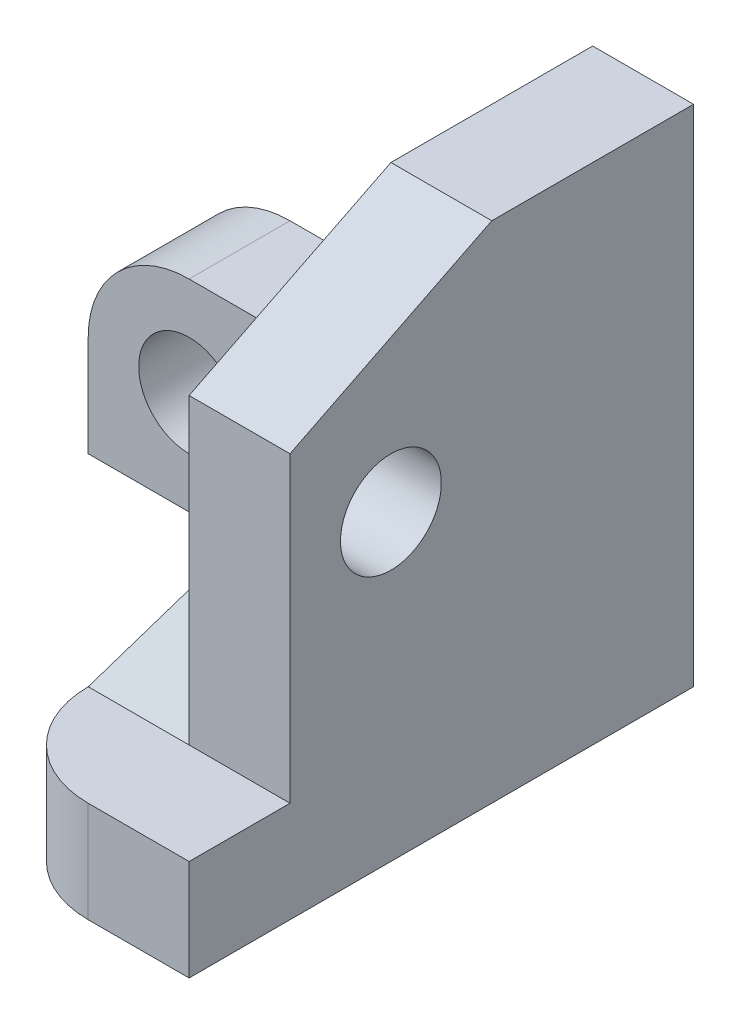
ISO-10303-21;
HEADER;
FILE_DESCRIPTION(('STEP AP214'),'2;1');
FILE_NAME('part.step','',(''),(''),'','','');
FILE_SCHEMA(('AUTOMOTIVE_DESIGN { 1 0 10303 214 1 1 1 1 }'));
ENDSEC;
DATA;
#1=APPLICATION_CONTEXT('core data for automotive mechanical design processes');
#2=APPLICATION_PROTOCOL_DEFINITION('international standard','automotive_design',2000,#1);
#3=PRODUCT_CONTEXT('',#1,'mechanical');
#4=PRODUCT('Part','Part','',(#3));
#5=PRODUCT_RELATED_PRODUCT_CATEGORY('part','',(#4));
#6=PRODUCT_DEFINITION_FORMATION('','',#4);
#7=PRODUCT_DEFINITION_CONTEXT('part definition',#1,'design');
#8=PRODUCT_DEFINITION('design','',#6,#7);
#9=PRODUCT_DEFINITION_SHAPE('','',#8);
#10=(LENGTH_UNIT() NAMED_UNIT(*) SI_UNIT(.MILLI.,.METRE.));
#11=(NAMED_UNIT(*) PLANE_ANGLE_UNIT() SI_UNIT($,.RADIAN.));
#12=(NAMED_UNIT(*) SI_UNIT($,.STERADIAN.) SOLID_ANGLE_UNIT());
#13=UNCERTAINTY_MEASURE_WITH_UNIT(LENGTH_MEASURE(1.E-05),#10,'distance_accuracy_value','');
#14=(GEOMETRIC_REPRESENTATION_CONTEXT(3) GLOBAL_UNCERTAINTY_ASSIGNED_CONTEXT((#13)) GLOBAL_UNIT_ASSIGNED_CONTEXT((#10,
#11,#12)) REPRESENTATION_CONTEXT('',''));
#15=CARTESIAN_POINT('',(0.,0.,0.));
#16=DIRECTION('',(0.,0.,1.));
#17=DIRECTION('',(1.,0.,0.));
#18=AXIS2_PLACEMENT_3D('',#15,#16,#17);
#19=CARTESIAN_POINT('',(50.,50.,40.));
#20=DIRECTION('',(0.,0.,-1.));
#21=DIRECTION('',(-1.,0.,0.));
#22=AXIS2_PLACEMENT_3D('',#19,#20,#21);
#23=PLANE('',#22);
#24=DIRECTION('',(-1.,0.,0.));
#25=VECTOR('',#24,1.);
#26=CARTESIAN_POINT('',(50.,10.,40.));
#27=LINE('',#26,#25);
#28=CARTESIAN_POINT('',(50.,10.,40.));
#29=VERTEX_POINT('',#28);
#30=CARTESIAN_POINT('',(40.,10.,40.));
#31=VERTEX_POINT('',#30);
#32=EDGE_CURVE('E149',#29,#31,#27,.T.);
#33=ORIENTED_EDGE('',*,*,#32,.F.);
#34=DIRECTION('',(0.,-1.,0.));
#35=VECTOR('',#34,1.);
#36=CARTESIAN_POINT('',(50.,50.,40.));
#37=LINE('',#36,#35);
#38=CARTESIAN_POINT('',(50.,40.,40.));
#39=VERTEX_POINT('',#38);
#40=EDGE_CURVE('E164',#39,#29,#37,.T.);
#41=ORIENTED_EDGE('',*,*,#40,.F.);
#42=DIRECTION('',(-1.,0.,0.));
#43=VECTOR('',#42,1.);
#44=CARTESIAN_POINT('',(80.,40.,40.));
#45=LINE('',#44,#43);
#46=CARTESIAN_POINT('',(40.,40.,40.));
#47=VERTEX_POINT('',#46);
#48=EDGE_CURVE('E253',#39,#47,#45,.T.);
#49=ORIENTED_EDGE('',*,*,#48,.T.);
#50=DIRECTION('',(0.,-1.,0.));
#51=VECTOR('',#50,1.);
#52=CARTESIAN_POINT('',(40.,50.,40.));
#53=LINE('',#52,#51);
#54=EDGE_CURVE('E166',#47,#31,#53,.T.);
#55=ORIENTED_EDGE('',*,*,#54,.T.);
#56=EDGE_LOOP('',(#33,#41,#49,#55));
#57=FACE_BOUND('',#56,.T.);
#58=ADVANCED_FACE('F43',(#57),#23,.F.);
#59=CARTESIAN_POINT('',(10.,10.,10.));
#60=DIRECTION('',(0.,0.,1.));
#61=DIRECTION('',(1.,0.,0.));
#62=AXIS2_PLACEMENT_3D('',#59,#60,#61);
#63=PLANE('',#62);
#64=CARTESIAN_POINT('',(10.,10.,10.));
#65=DIRECTION('',(0.,0.,1.));
#66=DIRECTION('',(1.,0.,0.));
#67=AXIS2_PLACEMENT_3D('',#64,#65,#66);
#68=CIRCLE('',#67,5.);
#69=CARTESIAN_POINT('',(15.,10.,10.));
#70=VERTEX_POINT('',#69);
#71=EDGE_CURVE('E187',#70,#70,#68,.T.);
#72=ORIENTED_EDGE('',*,*,#71,.F.);
#73=EDGE_LOOP('',(#72));
#74=FACE_BOUND('',#73,.T.);
#75=DIRECTION('',(1.,0.,0.));
#76=VECTOR('',#75,1.);
#77=CARTESIAN_POINT('',(0.,0.,10.));
#78=LINE('',#77,#76);
#79=CARTESIAN_POINT('',(0.,0.,10.));
#80=VERTEX_POINT('',#79);
#81=CARTESIAN_POINT('',(30.,0.,10.));
#82=VERTEX_POINT('',#81);
#83=EDGE_CURVE('E92',#80,#82,#78,.T.);
#84=ORIENTED_EDGE('',*,*,#83,.T.);
#85=DIRECTION('',(0.,-1.,0.));
#86=VECTOR('',#85,1.);
#87=CARTESIAN_POINT('',(30.,0.,10.));
#88=LINE('',#87,#86);
#89=CARTESIAN_POINT('',(30.,20.,10.));
#90=VERTEX_POINT('',#89);
#91=EDGE_CURVE('E273',#90,#82,#88,.T.);
#92=ORIENTED_EDGE('',*,*,#91,.F.);
#93=DIRECTION('',(-1.,0.,0.));
#94=VECTOR('',#93,1.);
#95=CARTESIAN_POINT('',(40.,20.,10.));
#96=LINE('',#95,#94);
#97=CARTESIAN_POINT('',(10.,20.,10.));
#98=VERTEX_POINT('',#97);
#99=EDGE_CURVE('E200',#90,#98,#96,.T.);
#100=ORIENTED_EDGE('',*,*,#99,.T.);
#101=CARTESIAN_POINT('',(10.,10.,10.));
#102=DIRECTION('',(0.,0.,1.));
#103=DIRECTION('',(1.,0.,0.));
#104=AXIS2_PLACEMENT_3D('',#101,#102,#103);
#105=CIRCLE('',#104,10.);
#106=CARTESIAN_POINT('',(0.,10.,10.));
#107=VERTEX_POINT('',#106);
#108=EDGE_CURVE('E68',#98,#107,#105,.T.);
#109=ORIENTED_EDGE('',*,*,#108,.T.);
#110=DIRECTION('',(0.,-1.,0.));
#111=VECTOR('',#110,1.);
#112=CARTESIAN_POINT('',(0.,10.,10.));
#113=LINE('',#112,#111);
#114=EDGE_CURVE('E195',#107,#80,#113,.T.);
#115=ORIENTED_EDGE('',*,*,#114,.T.);
#116=EDGE_LOOP('',(#84,#92,#100,#109,#115));
#117=FACE_BOUND('',#116,.T.);
#118=ADVANCED_FACE('F316',(#74,#117),#63,.T.);
#119=CARTESIAN_POINT('',(40.,50.,40.));
#120=DIRECTION('',(1.,0.,0.));
#121=DIRECTION('',(0.,0.,-1.));
#122=AXIS2_PLACEMENT_3D('',#119,#120,#121);
#123=PLANE('',#122);
#124=CARTESIAN_POINT('',(40.,30.,30.));
#125=DIRECTION('',(-1.,0.,0.));
#126=DIRECTION('',(0.,0.,1.));
#127=AXIS2_PLACEMENT_3D('',#124,#125,#126);
#128=CIRCLE('',#127,5.);
#129=CARTESIAN_POINT('',(40.,30.,35.));
#130=VERTEX_POINT('',#129);
#131=EDGE_CURVE('E266',#130,#130,#128,.T.);
#132=ORIENTED_EDGE('',*,*,#131,.F.);
#133=EDGE_LOOP('',(#132));
#134=FACE_BOUND('',#133,.T.);
#135=DIRECTION('',(0.,0.316227766016838,-0.948683298050514));
#136=VECTOR('',#135,1.);
#137=CARTESIAN_POINT('',(40.,20.,10.));
#138=LINE('',#137,#136);
#139=CARTESIAN_POINT('',(40.,20.,10.));
#140=VERTEX_POINT('',#139);
#141=EDGE_CURVE('E274',#31,#140,#138,.T.);
#142=ORIENTED_EDGE('',*,*,#141,.F.);
#143=ORIENTED_EDGE('',*,*,#54,.F.);
#144=DIRECTION('',(0.,-0.447213595499958,0.894427190999916));
#145=VECTOR('',#144,1.);
#146=CARTESIAN_POINT('',(40.,40.,40.));
#147=LINE('',#146,#145);
#148=CARTESIAN_POINT('',(40.,50.,20.));
#149=VERTEX_POINT('',#148);
#150=EDGE_CURVE('E263',#149,#47,#147,.T.);
#151=ORIENTED_EDGE('',*,*,#150,.F.);
#152=DIRECTION('',(0.,0.,1.));
#153=VECTOR('',#152,1.);
#154=CARTESIAN_POINT('',(40.,50.,0.));
#155=LINE('',#154,#153);
#156=CARTESIAN_POINT('',(40.,50.,0.));
#157=VERTEX_POINT('',#156);
#158=EDGE_CURVE('E251',#157,#149,#155,.T.);
#159=ORIENTED_EDGE('',*,*,#158,.F.);
#160=DIRECTION('',(0.,-1.,0.));
#161=VECTOR('',#160,1.);
#162=CARTESIAN_POINT('',(40.,50.,0.));
#163=LINE('',#162,#161);
#164=CARTESIAN_POINT('',(40.,20.,0.));
#165=VERTEX_POINT('',#164);
#166=EDGE_CURVE('E177',#157,#165,#163,.T.);
#167=ORIENTED_EDGE('',*,*,#166,.T.);
#168=DIRECTION('',(0.,0.,-1.));
#169=VECTOR('',#168,1.);
#170=CARTESIAN_POINT('',(40.,20.,10.));
#171=LINE('',#170,#169);
#172=EDGE_CURVE('E224',#140,#165,#171,.T.);
#173=ORIENTED_EDGE('',*,*,#172,.F.);
#174=EDGE_LOOP('',(#142,#143,#151,#159,#167,#173));
#175=FACE_BOUND('',#174,.T.);
#176=ADVANCED_FACE('F339',(#134,#175),#123,.F.);
#177=CARTESIAN_POINT('',(10.,10.,0.));
#178=DIRECTION('',(0.,0.,1.));
#179=DIRECTION('',(1.,0.,0.));
#180=AXIS2_PLACEMENT_3D('',#177,#178,#179);
#181=PLANE('',#180);
#182=DIRECTION('',(0.,-1.,0.));
#183=VECTOR('',#182,1.);
#184=CARTESIAN_POINT('',(0.,10.,0.));
#185=LINE('',#184,#183);
#186=CARTESIAN_POINT('',(0.,10.,0.));
#187=VERTEX_POINT('',#186);
#188=CARTESIAN_POINT('',(0.,0.,0.));
#189=VERTEX_POINT('',#188);
#190=EDGE_CURVE('E191',#187,#189,#185,.T.);
#191=ORIENTED_EDGE('',*,*,#190,.F.);
#192=CARTESIAN_POINT('',(10.,10.,0.));
#193=DIRECTION('',(0.,0.,1.));
#194=DIRECTION('',(1.,0.,0.));
#195=AXIS2_PLACEMENT_3D('',#192,#193,#194);
#196=CIRCLE('',#195,10.);
#197=CARTESIAN_POINT('',(10.,20.,0.));
#198=VERTEX_POINT('',#197);
#199=EDGE_CURVE('E85',#198,#187,#196,.T.);
#200=ORIENTED_EDGE('',*,*,#199,.F.);
#201=DIRECTION('',(-1.,0.,0.));
#202=VECTOR('',#201,1.);
#203=CARTESIAN_POINT('',(40.,20.,0.));
#204=LINE('',#203,#202);
#205=EDGE_CURVE('E214',#165,#198,#204,.T.);
#206=ORIENTED_EDGE('',*,*,#205,.F.);
#207=ORIENTED_EDGE('',*,*,#166,.F.);
#208=DIRECTION('',(-1.,0.,0.));
#209=VECTOR('',#208,1.);
#210=CARTESIAN_POINT('',(40.,50.,0.));
#211=LINE('',#210,#209);
#212=CARTESIAN_POINT('',(50.,50.,0.));
#213=VERTEX_POINT('',#212);
#214=EDGE_CURVE('E243',#213,#157,#211,.T.);
#215=ORIENTED_EDGE('',*,*,#214,.F.);
#216=DIRECTION('',(0.,-1.,0.));
#217=VECTOR('',#216,1.);
#218=CARTESIAN_POINT('',(50.,50.,0.));
#219=LINE('',#218,#217);
#220=CARTESIAN_POINT('',(50.,0.,0.));
#221=VERTEX_POINT('',#220);
#222=EDGE_CURVE('E173',#213,#221,#219,.T.);
#223=ORIENTED_EDGE('',*,*,#222,.T.);
#224=DIRECTION('',(1.,0.,0.));
#225=VECTOR('',#224,1.);
#226=CARTESIAN_POINT('',(0.,0.,0.));
#227=LINE('',#226,#225);
#228=EDGE_CURVE('E211',#189,#221,#227,.T.);
#229=ORIENTED_EDGE('',*,*,#228,.F.);
#230=EDGE_LOOP('',(#191,#200,#206,#207,#215,#223,#229));
#231=FACE_BOUND('',#230,.T.);
#232=CARTESIAN_POINT('',(10.,10.,0.));
#233=DIRECTION('',(0.,0.,1.));
#234=DIRECTION('',(1.,0.,0.));
#235=AXIS2_PLACEMENT_3D('',#232,#233,#234);
#236=CIRCLE('',#235,5.);
#237=CARTESIAN_POINT('',(15.,10.,0.));
#238=VERTEX_POINT('',#237);
#239=EDGE_CURVE('E186',#238,#238,#236,.T.);
#240=ORIENTED_EDGE('',*,*,#239,.T.);
#241=EDGE_LOOP('',(#240));
#242=FACE_BOUND('',#241,.T.);
#243=ADVANCED_FACE('F236',(#231,#242),#181,.F.);
#244=CARTESIAN_POINT('',(0.,10.,10.));
#245=DIRECTION('',(1.,0.,0.));
#246=DIRECTION('',(0.,1.,0.));
#247=AXIS2_PLACEMENT_3D('',#244,#245,#246);
#248=PLANE('',#247);
#249=ORIENTED_EDGE('',*,*,#190,.T.);
#250=DIRECTION('',(0.,0.,-1.));
#251=VECTOR('',#250,1.);
#252=CARTESIAN_POINT('',(0.,0.,10.));
#253=LINE('',#252,#251);
#254=EDGE_CURVE('E53',#80,#189,#253,.T.);
#255=ORIENTED_EDGE('',*,*,#254,.F.);
#256=ORIENTED_EDGE('',*,*,#114,.F.);
#257=DIRECTION('',(0.,0.,-1.));
#258=VECTOR('',#257,1.);
#259=CARTESIAN_POINT('',(0.,10.,10.));
#260=LINE('',#259,#258);
#261=EDGE_CURVE('E207',#107,#187,#260,.T.);
#262=ORIENTED_EDGE('',*,*,#261,.T.);
#263=EDGE_LOOP('',(#249,#255,#256,#262));
#264=FACE_BOUND('',#263,.T.);
#265=ADVANCED_FACE('F45',(#264),#248,.F.);
#266=CARTESIAN_POINT('',(0.,0.,10.));
#267=DIRECTION('',(0.,1.,0.));
#268=DIRECTION('',(0.,0.,1.));
#269=AXIS2_PLACEMENT_3D('',#266,#267,#268);
#270=PLANE('',#269);
#271=ORIENTED_EDGE('',*,*,#228,.T.);
#272=DIRECTION('',(0.,0.,-1.));
#273=VECTOR('',#272,1.);
#274=CARTESIAN_POINT('',(50.,0.,0.));
#275=LINE('',#274,#273);
#276=CARTESIAN_POINT('',(50.,0.,50.));
#277=VERTEX_POINT('',#276);
#278=EDGE_CURVE('E244',#277,#221,#275,.T.);
#279=ORIENTED_EDGE('',*,*,#278,.F.);
#280=DIRECTION('',(1.,0.,0.));
#281=VECTOR('',#280,1.);
#282=CARTESIAN_POINT('',(40.,0.,50.));
#283=LINE('',#282,#281);
#284=CARTESIAN_POINT('',(40.,0.,50.));
#285=VERTEX_POINT('',#284);
#286=EDGE_CURVE('E158',#285,#277,#283,.T.);
#287=ORIENTED_EDGE('',*,*,#286,.F.);
#288=CARTESIAN_POINT('',(40.,0.,40.));
#289=DIRECTION('',(0.,1.,0.));
#290=DIRECTION('',(0.,0.,1.));
#291=AXIS2_PLACEMENT_3D('',#288,#289,#290);
#292=CIRCLE('',#291,10.);
#293=CARTESIAN_POINT('',(30.,0.,40.));
#294=VERTEX_POINT('',#293);
#295=EDGE_CURVE('E298',#294,#285,#292,.T.);
#296=ORIENTED_EDGE('',*,*,#295,.F.);
#297=DIRECTION('',(0.,0.,1.));
#298=VECTOR('',#297,1.);
#299=CARTESIAN_POINT('',(30.,0.,40.));
#300=LINE('',#299,#298);
#301=EDGE_CURVE('E277',#82,#294,#300,.T.);
#302=ORIENTED_EDGE('',*,*,#301,.F.);
#303=ORIENTED_EDGE('',*,*,#83,.F.);
#304=ORIENTED_EDGE('',*,*,#254,.T.);
#305=EDGE_LOOP('',(#271,#279,#287,#296,#302,#303,#304));
#306=FACE_BOUND('',#305,.T.);
#307=ADVANCED_FACE('F230',(#306),#270,.F.);
#308=CARTESIAN_POINT('',(40.,20.,10.));
#309=DIRECTION('',(0.,-1.,0.));
#310=DIRECTION('',(1.,0.,0.));
#311=AXIS2_PLACEMENT_3D('',#308,#309,#310);
#312=PLANE('',#311);
#313=ORIENTED_EDGE('',*,*,#205,.T.);
#314=DIRECTION('',(0.,0.,-1.));
#315=VECTOR('',#314,1.);
#316=CARTESIAN_POINT('',(10.,20.,10.));
#317=LINE('',#316,#315);
#318=EDGE_CURVE('E221',#98,#198,#317,.T.);
#319=ORIENTED_EDGE('',*,*,#318,.F.);
#320=ORIENTED_EDGE('',*,*,#99,.F.);
#321=EDGE_CURVE('E201',#140,#90,#96,.T.);
#322=ORIENTED_EDGE('',*,*,#321,.F.);
#323=ORIENTED_EDGE('',*,*,#172,.T.);
#324=EDGE_LOOP('',(#313,#319,#320,#322,#323));
#325=FACE_BOUND('',#324,.T.);
#326=ADVANCED_FACE('F320',(#325),#312,.F.);
#327=CARTESIAN_POINT('',(10.,10.,10.));
#328=DIRECTION('',(0.,0.,-1.));
#329=DIRECTION('',(-1.,0.,0.));
#330=AXIS2_PLACEMENT_3D('',#327,#328,#329);
#331=CYLINDRICAL_SURFACE('',#330,10.);
#332=ORIENTED_EDGE('',*,*,#199,.T.);
#333=ORIENTED_EDGE('',*,*,#261,.F.);
#334=ORIENTED_EDGE('',*,*,#108,.F.);
#335=ORIENTED_EDGE('',*,*,#318,.T.);
#336=EDGE_LOOP('',(#332,#333,#334,#335));
#337=FACE_BOUND('',#336,.T.);
#338=ADVANCED_FACE('F322',(#337),#331,.T.);
#339=CARTESIAN_POINT('',(10.,10.,10.));
#340=DIRECTION('',(0.,0.,-1.));
#341=DIRECTION('',(-1.,0.,0.));
#342=AXIS2_PLACEMENT_3D('',#339,#340,#341);
#343=CYLINDRICAL_SURFACE('',#342,5.);
#344=ORIENTED_EDGE('',*,*,#71,.T.);
#345=EDGE_LOOP('',(#344));
#346=FACE_BOUND('',#345,.T.);
#347=ORIENTED_EDGE('',*,*,#239,.F.);
#348=EDGE_LOOP('',(#347));
#349=FACE_BOUND('',#348,.T.);
#350=ADVANCED_FACE('F324',(#346,#349),#343,.F.);
#351=CARTESIAN_POINT('',(50.,50.,0.));
#352=DIRECTION('',(-1.,0.,0.));
#353=DIRECTION('',(0.,0.,1.));
#354=AXIS2_PLACEMENT_3D('',#351,#352,#353);
#355=PLANE('',#354);
#356=CARTESIAN_POINT('',(50.,30.,30.));
#357=DIRECTION('',(-1.,0.,0.));
#358=DIRECTION('',(0.,0.,1.));
#359=AXIS2_PLACEMENT_3D('',#356,#357,#358);
#360=CIRCLE('',#359,5.);
#361=CARTESIAN_POINT('',(50.,30.,35.));
#362=VERTEX_POINT('',#361);
#363=EDGE_CURVE('E47',#362,#362,#360,.T.);
#364=ORIENTED_EDGE('',*,*,#363,.T.);
#365=EDGE_LOOP('',(#364));
#366=FACE_BOUND('',#365,.T.);
#367=DIRECTION('',(0.,0.,-1.));
#368=VECTOR('',#367,1.);
#369=CARTESIAN_POINT('',(50.,50.,0.));
#370=LINE('',#369,#368);
#371=CARTESIAN_POINT('',(50.,50.,20.));
#372=VERTEX_POINT('',#371);
#373=EDGE_CURVE('E180',#372,#213,#370,.T.);
#374=ORIENTED_EDGE('',*,*,#373,.F.);
#375=DIRECTION('',(0.,-0.447213595499958,0.894427190999916));
#376=VECTOR('',#375,1.);
#377=CARTESIAN_POINT('',(50.,58.,4.));
#378=LINE('',#377,#376);
#379=EDGE_CURVE('E60',#372,#39,#378,.T.);
#380=ORIENTED_EDGE('',*,*,#379,.T.);
#381=ORIENTED_EDGE('',*,*,#40,.T.);
#382=DIRECTION('',(0.,0.,-1.));
#383=VECTOR('',#382,1.);
#384=CARTESIAN_POINT('',(50.,10.,50.));
#385=LINE('',#384,#383);
#386=CARTESIAN_POINT('',(50.,10.,50.));
#387=VERTEX_POINT('',#386);
#388=EDGE_CURVE('E146',#387,#29,#385,.T.);
#389=ORIENTED_EDGE('',*,*,#388,.F.);
#390=DIRECTION('',(0.,-1.,0.));
#391=VECTOR('',#390,1.);
#392=CARTESIAN_POINT('',(50.,10.,50.));
#393=LINE('',#392,#391);
#394=EDGE_CURVE('E245',#387,#277,#393,.T.);
#395=ORIENTED_EDGE('',*,*,#394,.T.);
#396=ORIENTED_EDGE('',*,*,#278,.T.);
#397=ORIENTED_EDGE('',*,*,#222,.F.);
#398=EDGE_LOOP('',(#374,#380,#381,#389,#395,#396,#397));
#399=FACE_BOUND('',#398,.T.);
#400=ADVANCED_FACE('F171',(#366,#399),#355,.F.);
#401=CARTESIAN_POINT('',(0.,50.,0.));
#402=DIRECTION('',(0.,-1.,0.));
#403=DIRECTION('',(0.,0.,-1.));
#404=AXIS2_PLACEMENT_3D('',#401,#402,#403);
#405=PLANE('',#404);
#406=ORIENTED_EDGE('',*,*,#158,.T.);
#407=DIRECTION('',(1.,0.,0.));
#408=VECTOR('',#407,1.);
#409=CARTESIAN_POINT('',(0.,50.,20.));
#410=LINE('',#409,#408);
#411=EDGE_CURVE('E11',#149,#372,#410,.T.);
#412=ORIENTED_EDGE('',*,*,#411,.T.);
#413=ORIENTED_EDGE('',*,*,#373,.T.);
#414=ORIENTED_EDGE('',*,*,#214,.T.);
#415=EDGE_LOOP('',(#406,#412,#413,#414));
#416=FACE_BOUND('',#415,.T.);
#417=ADVANCED_FACE('F433',(#416),#405,.F.);
#418=CARTESIAN_POINT('',(80.,40.,40.));
#419=DIRECTION('',(0.,-0.894427190999916,-0.447213595499958));
#420=DIRECTION('',(0.,0.447213595499958,-0.894427190999916));
#421=AXIS2_PLACEMENT_3D('',#418,#419,#420);
#422=PLANE('',#421);
#423=ORIENTED_EDGE('',*,*,#411,.F.);
#424=ORIENTED_EDGE('',*,*,#150,.T.);
#425=ORIENTED_EDGE('',*,*,#48,.F.);
#426=ORIENTED_EDGE('',*,*,#379,.F.);
#427=EDGE_LOOP('',(#423,#424,#425,#426));
#428=FACE_BOUND('',#427,.T.);
#429=ADVANCED_FACE('F473',(#428),#422,.F.);
#430=CARTESIAN_POINT('',(80.,30.,30.));
#431=DIRECTION('',(-1.,0.,0.));
#432=DIRECTION('',(0.,0.,1.));
#433=AXIS2_PLACEMENT_3D('',#430,#431,#432);
#434=CYLINDRICAL_SURFACE('',#433,5.);
#435=ORIENTED_EDGE('',*,*,#131,.T.);
#436=EDGE_LOOP('',(#435));
#437=FACE_BOUND('',#436,.T.);
#438=ORIENTED_EDGE('',*,*,#363,.F.);
#439=EDGE_LOOP('',(#438));
#440=FACE_BOUND('',#439,.T.);
#441=ADVANCED_FACE('F390',(#437,#440),#434,.F.);
#442=CARTESIAN_POINT('',(30.,20.,10.));
#443=DIRECTION('',(0.,-0.948683298050514,-0.316227766016838));
#444=DIRECTION('',(0.,0.316227766016838,-0.948683298050514));
#445=AXIS2_PLACEMENT_3D('',#442,#443,#444);
#446=PLANE('',#445);
#447=ORIENTED_EDGE('',*,*,#141,.T.);
#448=ORIENTED_EDGE('',*,*,#321,.T.);
#449=DIRECTION('',(0.,0.316227766016838,-0.948683298050514));
#450=VECTOR('',#449,1.);
#451=CARTESIAN_POINT('',(30.,20.,10.));
#452=LINE('',#451,#450);
#453=CARTESIAN_POINT('',(30.,10.,40.));
#454=VERTEX_POINT('',#453);
#455=EDGE_CURVE('E281',#454,#90,#452,.T.);
#456=ORIENTED_EDGE('',*,*,#455,.F.);
#457=DIRECTION('',(1.,0.,0.));
#458=VECTOR('',#457,1.);
#459=CARTESIAN_POINT('',(30.,10.,40.));
#460=LINE('',#459,#458);
#461=EDGE_CURVE('E270',#454,#31,#460,.T.);
#462=ORIENTED_EDGE('',*,*,#461,.T.);
#463=EDGE_LOOP('',(#447,#448,#456,#462));
#464=FACE_BOUND('',#463,.T.);
#465=ADVANCED_FACE('F399',(#464),#446,.F.);
#466=CARTESIAN_POINT('',(30.,0.,0.));
#467=DIRECTION('',(1.,0.,0.));
#468=DIRECTION('',(0.,0.,-1.));
#469=AXIS2_PLACEMENT_3D('',#466,#467,#468);
#470=PLANE('',#469);
#471=ORIENTED_EDGE('',*,*,#301,.T.);
#472=DIRECTION('',(0.,1.,0.));
#473=VECTOR('',#472,1.);
#474=CARTESIAN_POINT('',(30.,10.,40.));
#475=LINE('',#474,#473);
#476=EDGE_CURVE('E284',#294,#454,#475,.T.);
#477=ORIENTED_EDGE('',*,*,#476,.T.);
#478=ORIENTED_EDGE('',*,*,#455,.T.);
#479=ORIENTED_EDGE('',*,*,#91,.T.);
#480=EDGE_LOOP('',(#471,#477,#478,#479));
#481=FACE_BOUND('',#480,.T.);
#482=ADVANCED_FACE('F312',(#481),#470,.F.);
#483=CARTESIAN_POINT('',(40.,10.,40.));
#484=DIRECTION('',(0.,-1.,0.));
#485=DIRECTION('',(0.,0.,-1.));
#486=AXIS2_PLACEMENT_3D('',#483,#484,#485);
#487=CYLINDRICAL_SURFACE('',#486,10.);
#488=ORIENTED_EDGE('',*,*,#295,.T.);
#489=DIRECTION('',(0.,-1.,0.));
#490=VECTOR('',#489,1.);
#491=CARTESIAN_POINT('',(40.,10.,50.));
#492=LINE('',#491,#490);
#493=CARTESIAN_POINT('',(40.,10.,50.));
#494=VERTEX_POINT('',#493);
#495=EDGE_CURVE('E278',#494,#285,#492,.T.);
#496=ORIENTED_EDGE('',*,*,#495,.F.);
#497=CARTESIAN_POINT('',(40.,10.,40.));
#498=DIRECTION('',(0.,1.,0.));
#499=DIRECTION('',(0.,0.,1.));
#500=AXIS2_PLACEMENT_3D('',#497,#498,#499);
#501=CIRCLE('',#500,10.);
#502=EDGE_CURVE('E168',#454,#494,#501,.T.);
#503=ORIENTED_EDGE('',*,*,#502,.F.);
#504=ORIENTED_EDGE('',*,*,#476,.F.);
#505=EDGE_LOOP('',(#488,#496,#503,#504));
#506=FACE_BOUND('',#505,.T.);
#507=ADVANCED_FACE('F307',(#506),#487,.T.);
#508=CARTESIAN_POINT('',(40.,10.,50.));
#509=DIRECTION('',(0.,0.,-1.));
#510=DIRECTION('',(-1.,0.,0.));
#511=AXIS2_PLACEMENT_3D('',#508,#509,#510);
#512=PLANE('',#511);
#513=ORIENTED_EDGE('',*,*,#286,.T.);
#514=ORIENTED_EDGE('',*,*,#394,.F.);
#515=DIRECTION('',(1.,0.,0.));
#516=VECTOR('',#515,1.);
#517=CARTESIAN_POINT('',(40.,10.,50.));
#518=LINE('',#517,#516);
#519=EDGE_CURVE('E152',#494,#387,#518,.T.);
#520=ORIENTED_EDGE('',*,*,#519,.F.);
#521=ORIENTED_EDGE('',*,*,#495,.T.);
#522=EDGE_LOOP('',(#513,#514,#520,#521));
#523=FACE_BOUND('',#522,.T.);
#524=ADVANCED_FACE('F310',(#523),#512,.F.);
#525=CARTESIAN_POINT('',(40.,10.,40.));
#526=DIRECTION('',(0.,1.,0.));
#527=DIRECTION('',(0.,0.,1.));
#528=AXIS2_PLACEMENT_3D('',#525,#526,#527);
#529=PLANE('',#528);
#530=ORIENTED_EDGE('',*,*,#388,.T.);
#531=ORIENTED_EDGE('',*,*,#32,.T.);
#532=ORIENTED_EDGE('',*,*,#461,.F.);
#533=ORIENTED_EDGE('',*,*,#502,.T.);
#534=ORIENTED_EDGE('',*,*,#519,.T.);
#535=EDGE_LOOP('',(#530,#531,#532,#533,#534));
#536=FACE_BOUND('',#535,.T.);
#537=ADVANCED_FACE('F148',(#536),#529,.T.);
#538=CLOSED_SHELL('',(#58,#118,#176,#243,#265,#307,#326,#338,#350,#400,#417,#429,#441,#465,#482,
#507,#524,#537));
#539=MANIFOLD_SOLID_BREP('B2',#538);
#540=ADVANCED_BREP_SHAPE_REPRESENTATION('',(#18,#539),#14);
#541=SHAPE_DEFINITION_REPRESENTATION(#9,#540);
ENDSEC;
END-ISO-10303-21;
